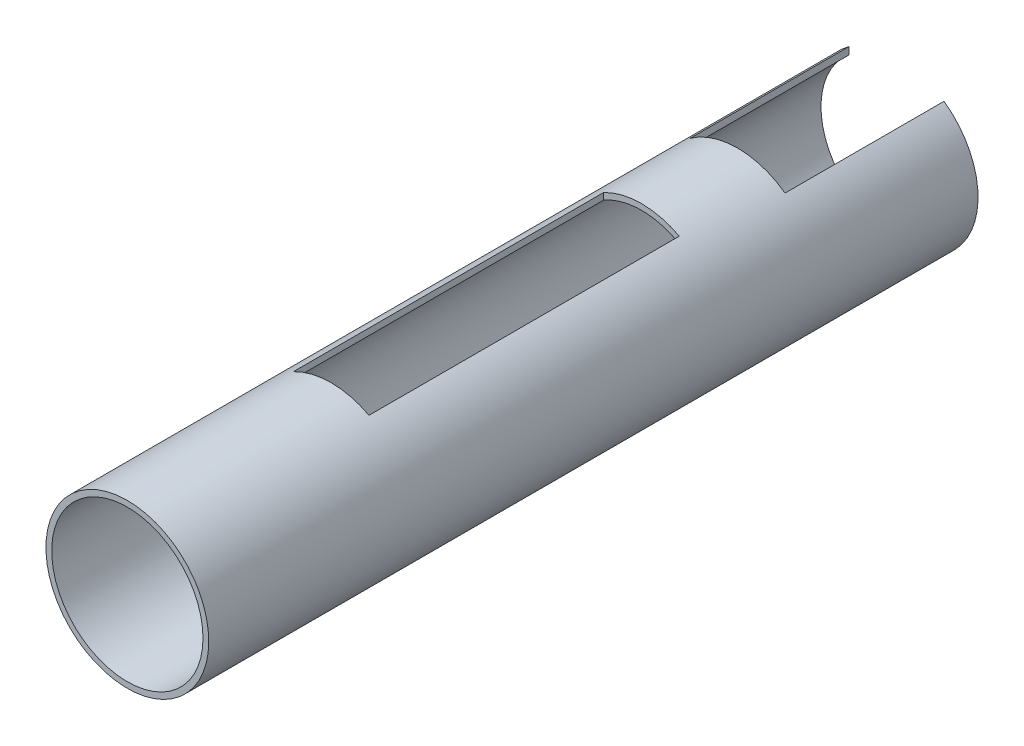
ISO-10303-21;
HEADER;
FILE_DESCRIPTION(('STEP AP214'),'2;1');
FILE_NAME('part.step','',(''),(''),'','','');
FILE_SCHEMA(('AUTOMOTIVE_DESIGN { 1 0 10303 214 1 1 1 1 }'));
ENDSEC;
DATA;
#1=APPLICATION_CONTEXT('core data for automotive mechanical design processes');
#2=APPLICATION_PROTOCOL_DEFINITION('international standard','automotive_design',2000,#1);
#3=PRODUCT_CONTEXT('',#1,'mechanical');
#4=PRODUCT('Part','Part','',(#3));
#5=PRODUCT_RELATED_PRODUCT_CATEGORY('part','',(#4));
#6=PRODUCT_DEFINITION_FORMATION('','',#4);
#7=PRODUCT_DEFINITION_CONTEXT('part definition',#1,'design');
#8=PRODUCT_DEFINITION('design','',#6,#7);
#9=PRODUCT_DEFINITION_SHAPE('','',#8);
#10=(LENGTH_UNIT() NAMED_UNIT(*) SI_UNIT(.MILLI.,.METRE.));
#11=(NAMED_UNIT(*) PLANE_ANGLE_UNIT() SI_UNIT($,.RADIAN.));
#12=(NAMED_UNIT(*) SI_UNIT($,.STERADIAN.) SOLID_ANGLE_UNIT());
#13=UNCERTAINTY_MEASURE_WITH_UNIT(LENGTH_MEASURE(1.E-05),#10,'distance_accuracy_value','');
#14=(GEOMETRIC_REPRESENTATION_CONTEXT(3) GLOBAL_UNCERTAINTY_ASSIGNED_CONTEXT((#13)) GLOBAL_UNIT_ASSIGNED_CONTEXT((#10,
#11,#12)) REPRESENTATION_CONTEXT('',''));
#15=CARTESIAN_POINT('',(0.,0.,0.));
#16=DIRECTION('',(0.,0.,1.));
#17=DIRECTION('',(1.,0.,0.));
#18=AXIS2_PLACEMENT_3D('',#15,#16,#17);
#19=CARTESIAN_POINT('',(0.,0.,0.));
#20=DIRECTION('',(0.,0.,1.));
#21=DIRECTION('',(1.,0.,0.));
#22=AXIS2_PLACEMENT_3D('',#19,#20,#21);
#23=PLANE('',#22);
#24=DIRECTION('',(0.,-1.,0.));
#25=VECTOR('',#24,1.);
#26=CARTESIAN_POINT('',(18.5,31.751,0.));
#27=LINE('',#26,#25);
#28=CARTESIAN_POINT('',(18.5,25.8033428066985,0.));
#29=VERTEX_POINT('',#28);
#30=CARTESIAN_POINT('',(18.5,22.9782505861521,0.));
#31=VERTEX_POINT('',#30);
#32=EDGE_CURVE('E207',#29,#31,#27,.T.);
#33=ORIENTED_EDGE('',*,*,#32,.F.);
#34=CARTESIAN_POINT('',(0.,0.,0.));
#35=DIRECTION('',(0.,0.,1.));
#36=DIRECTION('',(1.,0.,0.));
#37=AXIS2_PLACEMENT_3D('',#34,#35,#36);
#38=CIRCLE('',#37,31.75);
#39=CARTESIAN_POINT('',(-18.5,25.8033428066985,0.));
#40=VERTEX_POINT('',#39);
#41=EDGE_CURVE('E218',#40,#29,#38,.T.);
#42=ORIENTED_EDGE('',*,*,#41,.F.);
#43=DIRECTION('',(0.,-1.,0.));
#44=VECTOR('',#43,1.);
#45=CARTESIAN_POINT('',(-18.5,31.751,0.));
#46=LINE('',#45,#44);
#47=CARTESIAN_POINT('',(-18.5,22.9782505861521,0.));
#48=VERTEX_POINT('',#47);
#49=EDGE_CURVE('E204',#40,#48,#46,.T.);
#50=ORIENTED_EDGE('',*,*,#49,.T.);
#51=CARTESIAN_POINT('',(0.,0.,0.));
#52=DIRECTION('',(0.,0.,1.));
#53=DIRECTION('',(1.,0.,0.));
#54=AXIS2_PLACEMENT_3D('',#51,#52,#53);
#55=CIRCLE('',#54,29.5);
#56=EDGE_CURVE('E214',#48,#31,#55,.T.);
#57=ORIENTED_EDGE('',*,*,#56,.T.);
#58=EDGE_LOOP('',(#33,#42,#50,#57));
#59=FACE_BOUND('',#58,.T.);
#60=ADVANCED_FACE('F33',(#59),#23,.F.);
#61=CARTESIAN_POINT('',(0.,0.,300.));
#62=DIRECTION('',(0.,0.,-1.));
#63=DIRECTION('',(-1.,0.,0.));
#64=AXIS2_PLACEMENT_3D('',#61,#62,#63);
#65=CYLINDRICAL_SURFACE('',#64,31.75);
#66=DIRECTION('',(0.,0.,-1.));
#67=VECTOR('',#66,1.);
#68=CARTESIAN_POINT('',(-14.75,-28.1158318390191,300.));
#69=LINE('',#68,#67);
#70=CARTESIAN_POINT('',(-14.75,-28.1158318390191,99.5));
#71=VERTEX_POINT('',#70);
#72=CARTESIAN_POINT('',(-14.75,-28.1158318390191,220.5));
#73=VERTEX_POINT('',#72);
#74=EDGE_CURVE('E192',#71,#73,#69,.F.);
#75=ORIENTED_EDGE('',*,*,#74,.T.);
#76=CARTESIAN_POINT('',(0.,0.,220.5));
#77=DIRECTION('',(0.,0.,1.));
#78=DIRECTION('',(1.,0.,0.));
#79=AXIS2_PLACEMENT_3D('',#76,#77,#78);
#80=CIRCLE('',#79,31.75);
#81=CARTESIAN_POINT('',(14.75,-28.1158318390191,220.5));
#82=VERTEX_POINT('',#81);
#83=EDGE_CURVE('E48',#73,#82,#80,.T.);
#84=ORIENTED_EDGE('',*,*,#83,.T.);
#85=DIRECTION('',(0.,0.,-1.));
#86=VECTOR('',#85,1.);
#87=CARTESIAN_POINT('',(14.75,-28.1158318390191,300.));
#88=LINE('',#87,#86);
#89=CARTESIAN_POINT('',(14.75,-28.1158318390191,99.5));
#90=VERTEX_POINT('',#89);
#91=EDGE_CURVE('E141',#82,#90,#88,.T.);
#92=ORIENTED_EDGE('',*,*,#91,.T.);
#93=CARTESIAN_POINT('',(0.,0.,99.5));
#94=DIRECTION('',(0.,0.,-1.));
#95=DIRECTION('',(-1.,0.,0.));
#96=AXIS2_PLACEMENT_3D('',#93,#94,#95);
#97=CIRCLE('',#96,31.75);
#98=EDGE_CURVE('E189',#90,#71,#97,.T.);
#99=ORIENTED_EDGE('',*,*,#98,.T.);
#100=EDGE_LOOP('',(#75,#84,#92,#99));
#101=FACE_BOUND('',#100,.T.);
#102=DIRECTION('',(0.,0.,-1.));
#103=VECTOR('',#102,1.);
#104=CARTESIAN_POINT('',(14.75,28.1158318390191,300.));
#105=LINE('',#104,#103);
#106=CARTESIAN_POINT('',(14.75,28.1158318390191,99.5));
#107=VERTEX_POINT('',#106);
#108=CARTESIAN_POINT('',(14.75,28.1158318390191,220.5));
#109=VERTEX_POINT('',#108);
#110=EDGE_CURVE('E181',#107,#109,#105,.F.);
#111=ORIENTED_EDGE('',*,*,#110,.T.);
#112=CARTESIAN_POINT('',(-14.75,28.1158318390191,220.5));
#113=VERTEX_POINT('',#112);
#114=EDGE_CURVE('E56',#109,#113,#80,.T.);
#115=ORIENTED_EDGE('',*,*,#114,.T.);
#116=DIRECTION('',(0.,0.,-1.));
#117=VECTOR('',#116,1.);
#118=CARTESIAN_POINT('',(-14.75,28.1158318390191,300.));
#119=LINE('',#118,#117);
#120=CARTESIAN_POINT('',(-14.75,28.1158318390191,99.5));
#121=VERTEX_POINT('',#120);
#122=EDGE_CURVE('E172',#113,#121,#119,.T.);
#123=ORIENTED_EDGE('',*,*,#122,.T.);
#124=EDGE_CURVE('E190',#121,#107,#97,.T.);
#125=ORIENTED_EDGE('',*,*,#124,.T.);
#126=EDGE_LOOP('',(#111,#115,#123,#125));
#127=FACE_BOUND('',#126,.T.);
#128=CARTESIAN_POINT('',(0.,0.,300.));
#129=DIRECTION('',(0.,0.,1.));
#130=DIRECTION('',(1.,0.,0.));
#131=AXIS2_PLACEMENT_3D('',#128,#129,#130);
#132=CIRCLE('',#131,31.75);
#133=CARTESIAN_POINT('',(31.75,0.,300.));
#134=VERTEX_POINT('',#133);
#135=EDGE_CURVE('E221',#134,#134,#132,.T.);
#136=ORIENTED_EDGE('',*,*,#135,.F.);
#137=EDGE_LOOP('',(#136));
#138=FACE_BOUND('',#137,.T.);
#139=DIRECTION('',(0.,0.,-1.));
#140=VECTOR('',#139,1.);
#141=CARTESIAN_POINT('',(18.5,25.8033428066985,300.));
#142=LINE('',#141,#140);
#143=CARTESIAN_POINT('',(18.5,25.8033428066985,62.));
#144=VERTEX_POINT('',#143);
#145=EDGE_CURVE('E195',#29,#144,#142,.F.);
#146=ORIENTED_EDGE('',*,*,#145,.T.);
#147=CARTESIAN_POINT('',(0.,0.,62.));
#148=DIRECTION('',(0.,0.,-1.));
#149=DIRECTION('',(-1.,0.,0.));
#150=AXIS2_PLACEMENT_3D('',#147,#148,#149);
#151=CIRCLE('',#150,31.75);
#152=CARTESIAN_POINT('',(-18.5,25.8033428066985,62.));
#153=VERTEX_POINT('',#152);
#154=EDGE_CURVE('E198',#144,#153,#151,.F.);
#155=ORIENTED_EDGE('',*,*,#154,.T.);
#156=DIRECTION('',(0.,0.,-1.));
#157=VECTOR('',#156,1.);
#158=CARTESIAN_POINT('',(-18.5,25.8033428066985,300.));
#159=LINE('',#158,#157);
#160=EDGE_CURVE('E201',#153,#40,#159,.T.);
#161=ORIENTED_EDGE('',*,*,#160,.T.);
#162=ORIENTED_EDGE('',*,*,#41,.T.);
#163=EDGE_LOOP('',(#146,#155,#161,#162));
#164=FACE_BOUND('',#163,.T.);
#165=ADVANCED_FACE('F35',(#101,#127,#138,#164),#65,.T.);
#166=CARTESIAN_POINT('',(0.,0.,300.));
#167=DIRECTION('',(0.,0.,-1.));
#168=DIRECTION('',(-1.,0.,0.));
#169=AXIS2_PLACEMENT_3D('',#166,#167,#168);
#170=CYLINDRICAL_SURFACE('',#169,29.5);
#171=DIRECTION('',(0.,0.,-1.));
#172=VECTOR('',#171,1.);
#173=CARTESIAN_POINT('',(-14.75,25.5477494116409,300.));
#174=LINE('',#173,#172);
#175=CARTESIAN_POINT('',(-14.75,25.5477494116409,220.5));
#176=VERTEX_POINT('',#175);
#177=CARTESIAN_POINT('',(-14.75,25.5477494116409,99.5));
#178=VERTEX_POINT('',#177);
#179=EDGE_CURVE('E11',#176,#178,#174,.T.);
#180=ORIENTED_EDGE('',*,*,#179,.F.);
#181=CARTESIAN_POINT('',(0.,0.,220.5));
#182=DIRECTION('',(0.,0.,1.));
#183=DIRECTION('',(1.,0.,0.));
#184=AXIS2_PLACEMENT_3D('',#181,#182,#183);
#185=CIRCLE('',#184,29.5);
#186=CARTESIAN_POINT('',(14.75,25.5477494116409,220.5));
#187=VERTEX_POINT('',#186);
#188=EDGE_CURVE('E136',#187,#176,#185,.T.);
#189=ORIENTED_EDGE('',*,*,#188,.F.);
#190=DIRECTION('',(0.,0.,-1.));
#191=VECTOR('',#190,1.);
#192=CARTESIAN_POINT('',(14.75,25.5477494116409,300.));
#193=LINE('',#192,#191);
#194=CARTESIAN_POINT('',(14.75,25.5477494116409,99.5));
#195=VERTEX_POINT('',#194);
#196=EDGE_CURVE('E154',#195,#187,#193,.F.);
#197=ORIENTED_EDGE('',*,*,#196,.F.);
#198=CARTESIAN_POINT('',(0.,0.,99.5));
#199=DIRECTION('',(0.,0.,-1.));
#200=DIRECTION('',(-1.,0.,0.));
#201=AXIS2_PLACEMENT_3D('',#198,#199,#200);
#202=CIRCLE('',#201,29.5);
#203=EDGE_CURVE('E41',#178,#195,#202,.T.);
#204=ORIENTED_EDGE('',*,*,#203,.F.);
#205=EDGE_LOOP('',(#180,#189,#197,#204));
#206=FACE_BOUND('',#205,.T.);
#207=DIRECTION('',(0.,0.,-1.));
#208=VECTOR('',#207,1.);
#209=CARTESIAN_POINT('',(-14.75,-25.5477494116409,300.));
#210=LINE('',#209,#208);
#211=CARTESIAN_POINT('',(-14.75,-25.5477494116409,99.5));
#212=VERTEX_POINT('',#211);
#213=CARTESIAN_POINT('',(-14.75,-25.5477494116409,220.5));
#214=VERTEX_POINT('',#213);
#215=EDGE_CURVE('E150',#212,#214,#210,.F.);
#216=ORIENTED_EDGE('',*,*,#215,.F.);
#217=CARTESIAN_POINT('',(14.75,-25.5477494116409,99.5));
#218=VERTEX_POINT('',#217);
#219=EDGE_CURVE('E148',#218,#212,#202,.T.);
#220=ORIENTED_EDGE('',*,*,#219,.F.);
#221=DIRECTION('',(0.,0.,-1.));
#222=VECTOR('',#221,1.);
#223=CARTESIAN_POINT('',(14.75,-25.5477494116409,300.));
#224=LINE('',#223,#222);
#225=CARTESIAN_POINT('',(14.75,-25.5477494116409,220.5));
#226=VERTEX_POINT('',#225);
#227=EDGE_CURVE('E133',#226,#218,#224,.T.);
#228=ORIENTED_EDGE('',*,*,#227,.F.);
#229=EDGE_CURVE('E122',#214,#226,#185,.T.);
#230=ORIENTED_EDGE('',*,*,#229,.F.);
#231=EDGE_LOOP('',(#216,#220,#228,#230));
#232=FACE_BOUND('',#231,.T.);
#233=CARTESIAN_POINT('',(0.,0.,300.));
#234=DIRECTION('',(0.,0.,1.));
#235=DIRECTION('',(1.,0.,0.));
#236=AXIS2_PLACEMENT_3D('',#233,#234,#235);
#237=CIRCLE('',#236,29.5);
#238=CARTESIAN_POINT('',(29.5,0.,300.));
#239=VERTEX_POINT('',#238);
#240=EDGE_CURVE('E215',#239,#239,#237,.T.);
#241=ORIENTED_EDGE('',*,*,#240,.T.);
#242=EDGE_LOOP('',(#241));
#243=FACE_BOUND('',#242,.T.);
#244=CARTESIAN_POINT('',(0.,0.,62.));
#245=DIRECTION('',(0.,0.,-1.));
#246=DIRECTION('',(-1.,0.,0.));
#247=AXIS2_PLACEMENT_3D('',#244,#245,#246);
#248=CIRCLE('',#247,29.5);
#249=CARTESIAN_POINT('',(-18.5,22.9782505861521,62.));
#250=VERTEX_POINT('',#249);
#251=CARTESIAN_POINT('',(18.5,22.9782505861521,62.));
#252=VERTEX_POINT('',#251);
#253=EDGE_CURVE('E229',#250,#252,#248,.T.);
#254=ORIENTED_EDGE('',*,*,#253,.T.);
#255=DIRECTION('',(0.,0.,-1.));
#256=VECTOR('',#255,1.);
#257=CARTESIAN_POINT('',(18.5,22.9782505861521,300.));
#258=LINE('',#257,#256);
#259=EDGE_CURVE('E134',#252,#31,#258,.T.);
#260=ORIENTED_EDGE('',*,*,#259,.T.);
#261=ORIENTED_EDGE('',*,*,#56,.F.);
#262=DIRECTION('',(0.,0.,-1.));
#263=VECTOR('',#262,1.);
#264=CARTESIAN_POINT('',(-18.5,22.9782505861521,300.));
#265=LINE('',#264,#263);
#266=EDGE_CURVE('E224',#48,#250,#265,.F.);
#267=ORIENTED_EDGE('',*,*,#266,.T.);
#268=EDGE_LOOP('',(#254,#260,#261,#267));
#269=FACE_BOUND('',#268,.T.);
#270=ADVANCED_FACE('F146',(#206,#232,#243,#269),#170,.F.);
#271=CARTESIAN_POINT('',(0.,0.,300.));
#272=DIRECTION('',(0.,0.,1.));
#273=DIRECTION('',(1.,0.,0.));
#274=AXIS2_PLACEMENT_3D('',#271,#272,#273);
#275=PLANE('',#274);
#276=ORIENTED_EDGE('',*,*,#135,.T.);
#277=EDGE_LOOP('',(#276));
#278=FACE_BOUND('',#277,.T.);
#279=ORIENTED_EDGE('',*,*,#240,.F.);
#280=EDGE_LOOP('',(#279));
#281=FACE_BOUND('',#280,.T.);
#282=ADVANCED_FACE('F248',(#278,#281),#275,.T.);
#283=CARTESIAN_POINT('',(18.5,31.751,0.));
#284=DIRECTION('',(-1.,0.,0.));
#285=DIRECTION('',(0.,0.,1.));
#286=AXIS2_PLACEMENT_3D('',#283,#284,#285);
#287=PLANE('',#286);
#288=DIRECTION('',(0.,-1.,0.));
#289=VECTOR('',#288,1.);
#290=CARTESIAN_POINT('',(18.5,31.751,62.));
#291=LINE('',#290,#289);
#292=EDGE_CURVE('E209',#144,#252,#291,.T.);
#293=ORIENTED_EDGE('',*,*,#292,.F.);
#294=ORIENTED_EDGE('',*,*,#145,.F.);
#295=ORIENTED_EDGE('',*,*,#32,.T.);
#296=ORIENTED_EDGE('',*,*,#259,.F.);
#297=EDGE_LOOP('',(#293,#294,#295,#296));
#298=FACE_BOUND('',#297,.T.);
#299=ADVANCED_FACE('F246',(#298),#287,.T.);
#300=CARTESIAN_POINT('',(-18.5,31.751,62.));
#301=DIRECTION('',(0.,0.,-1.));
#302=DIRECTION('',(-1.,0.,0.));
#303=AXIS2_PLACEMENT_3D('',#300,#301,#302);
#304=PLANE('',#303);
#305=DIRECTION('',(0.,-1.,0.));
#306=VECTOR('',#305,1.);
#307=CARTESIAN_POINT('',(-18.5,31.751,62.));
#308=LINE('',#307,#306);
#309=EDGE_CURVE('E212',#153,#250,#308,.T.);
#310=ORIENTED_EDGE('',*,*,#309,.F.);
#311=ORIENTED_EDGE('',*,*,#154,.F.);
#312=ORIENTED_EDGE('',*,*,#292,.T.);
#313=ORIENTED_EDGE('',*,*,#253,.F.);
#314=EDGE_LOOP('',(#310,#311,#312,#313));
#315=FACE_BOUND('',#314,.T.);
#316=ADVANCED_FACE('F245',(#315),#304,.T.);
#317=CARTESIAN_POINT('',(-18.5,31.751,0.));
#318=DIRECTION('',(1.,0.,0.));
#319=DIRECTION('',(0.,0.,-1.));
#320=AXIS2_PLACEMENT_3D('',#317,#318,#319);
#321=PLANE('',#320);
#322=ORIENTED_EDGE('',*,*,#49,.F.);
#323=ORIENTED_EDGE('',*,*,#160,.F.);
#324=ORIENTED_EDGE('',*,*,#309,.T.);
#325=ORIENTED_EDGE('',*,*,#266,.F.);
#326=EDGE_LOOP('',(#322,#323,#324,#325));
#327=FACE_BOUND('',#326,.T.);
#328=ADVANCED_FACE('F241',(#327),#321,.T.);
#329=CARTESIAN_POINT('',(-14.75,-31.75,220.5));
#330=DIRECTION('',(0.,0.,1.));
#331=DIRECTION('',(1.,0.,0.));
#332=AXIS2_PLACEMENT_3D('',#329,#330,#331);
#333=PLANE('',#332);
#334=DIRECTION('',(0.,1.,0.));
#335=VECTOR('',#334,1.);
#336=CARTESIAN_POINT('',(-14.75,-31.75,220.5));
#337=LINE('',#336,#335);
#338=EDGE_CURVE('E128',#73,#214,#337,.T.);
#339=ORIENTED_EDGE('',*,*,#338,.T.);
#340=ORIENTED_EDGE('',*,*,#229,.T.);
#341=DIRECTION('',(0.,1.,0.));
#342=VECTOR('',#341,1.);
#343=CARTESIAN_POINT('',(14.75,-31.75,220.5));
#344=LINE('',#343,#342);
#345=EDGE_CURVE('E125',#82,#226,#344,.T.);
#346=ORIENTED_EDGE('',*,*,#345,.F.);
#347=ORIENTED_EDGE('',*,*,#83,.F.);
#348=EDGE_LOOP('',(#339,#340,#346,#347));
#349=FACE_BOUND('',#348,.T.);
#350=ADVANCED_FACE('F124',(#349),#333,.F.);
#351=CARTESIAN_POINT('',(14.75,-31.75,99.5));
#352=DIRECTION('',(1.,0.,0.));
#353=DIRECTION('',(0.,0.,-1.));
#354=AXIS2_PLACEMENT_3D('',#351,#352,#353);
#355=PLANE('',#354);
#356=ORIENTED_EDGE('',*,*,#345,.T.);
#357=ORIENTED_EDGE('',*,*,#227,.T.);
#358=DIRECTION('',(0.,1.,0.));
#359=VECTOR('',#358,1.);
#360=CARTESIAN_POINT('',(14.75,-31.75,99.5));
#361=LINE('',#360,#359);
#362=EDGE_CURVE('E182',#90,#218,#361,.T.);
#363=ORIENTED_EDGE('',*,*,#362,.F.);
#364=ORIENTED_EDGE('',*,*,#91,.F.);
#365=EDGE_LOOP('',(#356,#357,#363,#364));
#366=FACE_BOUND('',#365,.T.);
#367=ADVANCED_FACE('F138',(#366),#355,.F.);
#368=CARTESIAN_POINT('',(-14.75,-31.75,99.5));
#369=DIRECTION('',(0.,0.,-1.));
#370=DIRECTION('',(-1.,0.,0.));
#371=AXIS2_PLACEMENT_3D('',#368,#369,#370);
#372=PLANE('',#371);
#373=ORIENTED_EDGE('',*,*,#362,.T.);
#374=ORIENTED_EDGE('',*,*,#219,.T.);
#375=DIRECTION('',(0.,1.,0.));
#376=VECTOR('',#375,1.);
#377=CARTESIAN_POINT('',(-14.75,-31.75,99.5));
#378=LINE('',#377,#376);
#379=EDGE_CURVE('E298',#71,#212,#378,.T.);
#380=ORIENTED_EDGE('',*,*,#379,.F.);
#381=ORIENTED_EDGE('',*,*,#98,.F.);
#382=EDGE_LOOP('',(#373,#374,#380,#381));
#383=FACE_BOUND('',#382,.T.);
#384=ADVANCED_FACE('F275',(#383),#372,.F.);
#385=CARTESIAN_POINT('',(-14.75,-31.75,99.5));
#386=DIRECTION('',(-1.,0.,0.));
#387=DIRECTION('',(0.,0.,1.));
#388=AXIS2_PLACEMENT_3D('',#385,#386,#387);
#389=PLANE('',#388);
#390=ORIENTED_EDGE('',*,*,#379,.T.);
#391=ORIENTED_EDGE('',*,*,#215,.T.);
#392=ORIENTED_EDGE('',*,*,#338,.F.);
#393=ORIENTED_EDGE('',*,*,#74,.F.);
#394=EDGE_LOOP('',(#390,#391,#392,#393));
#395=FACE_BOUND('',#394,.T.);
#396=ADVANCED_FACE('F288',(#395),#389,.F.);
#397=EDGE_CURVE('E164',#176,#113,#337,.T.);
#398=ORIENTED_EDGE('',*,*,#397,.F.);
#399=ORIENTED_EDGE('',*,*,#179,.T.);
#400=EDGE_CURVE('E178',#178,#121,#378,.T.);
#401=ORIENTED_EDGE('',*,*,#400,.T.);
#402=ORIENTED_EDGE('',*,*,#122,.F.);
#403=EDGE_LOOP('',(#398,#399,#401,#402));
#404=FACE_BOUND('',#403,.T.);
#405=ADVANCED_FACE('F169',(#404),#389,.F.);
#406=ORIENTED_EDGE('',*,*,#400,.F.);
#407=ORIENTED_EDGE('',*,*,#203,.T.);
#408=EDGE_CURVE('E142',#195,#107,#361,.T.);
#409=ORIENTED_EDGE('',*,*,#408,.T.);
#410=ORIENTED_EDGE('',*,*,#124,.F.);
#411=EDGE_LOOP('',(#406,#407,#409,#410));
#412=FACE_BOUND('',#411,.T.);
#413=ADVANCED_FACE('F177',(#412),#372,.F.);
#414=ORIENTED_EDGE('',*,*,#408,.F.);
#415=ORIENTED_EDGE('',*,*,#196,.T.);
#416=EDGE_CURVE('E143',#187,#109,#344,.T.);
#417=ORIENTED_EDGE('',*,*,#416,.T.);
#418=ORIENTED_EDGE('',*,*,#110,.F.);
#419=EDGE_LOOP('',(#414,#415,#417,#418));
#420=FACE_BOUND('',#419,.T.);
#421=ADVANCED_FACE('F180',(#420),#355,.F.);
#422=ORIENTED_EDGE('',*,*,#416,.F.);
#423=ORIENTED_EDGE('',*,*,#188,.T.);
#424=ORIENTED_EDGE('',*,*,#397,.T.);
#425=ORIENTED_EDGE('',*,*,#114,.F.);
#426=EDGE_LOOP('',(#422,#423,#424,#425));
#427=FACE_BOUND('',#426,.T.);
#428=ADVANCED_FACE('F163',(#427),#333,.F.);
#429=CLOSED_SHELL('',(#60,#165,#270,#282,#299,#316,#328,#350,#367,#384,#396,#405,#413,#421,#428));
#430=MANIFOLD_SOLID_BREP('B2',#429);
#431=ADVANCED_BREP_SHAPE_REPRESENTATION('',(#18,#430),#14);
#432=SHAPE_DEFINITION_REPRESENTATION(#9,#431);
ENDSEC;
END-ISO-10303-21;
